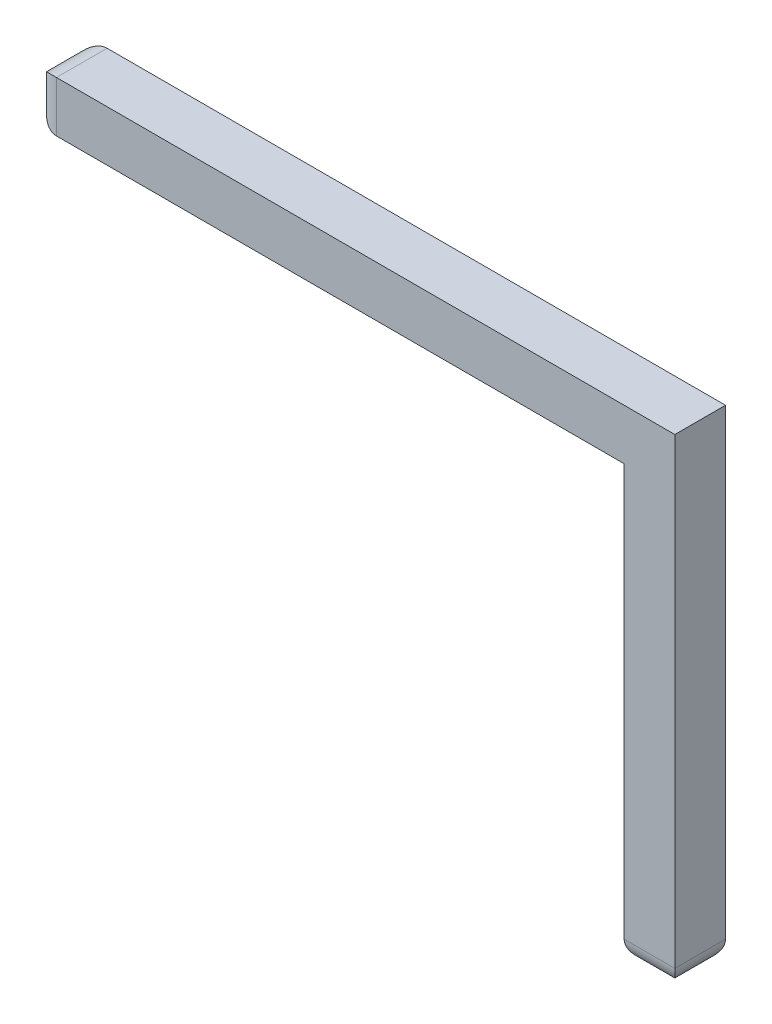
ISO-10303-21;
HEADER;
FILE_DESCRIPTION(('STEP AP214'),'2;1');
FILE_NAME('part.step','',(''),(''),'','','');
FILE_SCHEMA(('AUTOMOTIVE_DESIGN { 1 0 10303 214 1 1 1 1 }'));
ENDSEC;
DATA;
#1=APPLICATION_CONTEXT('core data for automotive mechanical design processes');
#2=APPLICATION_PROTOCOL_DEFINITION('international standard','automotive_design',2000,#1);
#3=PRODUCT_CONTEXT('',#1,'mechanical');
#4=PRODUCT('Part','Part','',(#3));
#5=PRODUCT_RELATED_PRODUCT_CATEGORY('part','',(#4));
#6=PRODUCT_DEFINITION_FORMATION('','',#4);
#7=PRODUCT_DEFINITION_CONTEXT('part definition',#1,'design');
#8=PRODUCT_DEFINITION('design','',#6,#7);
#9=PRODUCT_DEFINITION_SHAPE('','',#8);
#10=(LENGTH_UNIT() NAMED_UNIT(*) SI_UNIT(.MILLI.,.METRE.));
#11=(NAMED_UNIT(*) PLANE_ANGLE_UNIT() SI_UNIT($,.RADIAN.));
#12=(NAMED_UNIT(*) SI_UNIT($,.STERADIAN.) SOLID_ANGLE_UNIT());
#13=UNCERTAINTY_MEASURE_WITH_UNIT(LENGTH_MEASURE(1.E-05),#10,'distance_accuracy_value','');
#14=(GEOMETRIC_REPRESENTATION_CONTEXT(3) GLOBAL_UNCERTAINTY_ASSIGNED_CONTEXT((#13)) GLOBAL_UNIT_ASSIGNED_CONTEXT((#10,
#11,#12)) REPRESENTATION_CONTEXT('',''));
#15=CARTESIAN_POINT('',(0.,0.,0.));
#16=DIRECTION('',(0.,0.,1.));
#17=DIRECTION('',(1.,0.,0.));
#18=AXIS2_PLACEMENT_3D('',#15,#16,#17);
#19=CARTESIAN_POINT('',(2.7075,-0.55,11.095));
#20=DIRECTION('',(1.,0.,0.));
#21=DIRECTION('',(0.,-0.707106781186548,-0.707106781186548));
#22=AXIS2_PLACEMENT_3D('',#19,#20,#21);
#23=CYLINDRICAL_SURFACE('',#22,0.25);
#24=DIRECTION('',(-1.,0.,0.));
#25=VECTOR('',#24,1.);
#26=CARTESIAN_POINT('',(2.7075,-0.8,11.095));
#27=LINE('',#26,#25);
#28=CARTESIAN_POINT('',(2.615,-0.8,11.095));
#29=VERTEX_POINT('',#28);
#30=CARTESIAN_POINT('',(2.485,-0.8,11.095));
#31=VERTEX_POINT('',#30);
#32=EDGE_CURVE('E11',#29,#31,#27,.T.);
#33=ORIENTED_EDGE('',*,*,#32,.T.);
#34=CARTESIAN_POINT('',(2.485,-0.55,11.095));
#35=DIRECTION('',(0.707106781186548,0.,-0.707106781186548));
#36=DIRECTION('',(-0.707106781186548,0.,-0.707106781186548));
#37=AXIS2_PLACEMENT_3D('',#34,#35,#36);
#38=ELLIPSE('',#37,0.353553390593,0.25);
#39=CARTESIAN_POINT('',(2.235,-0.55,10.845));
#40=VERTEX_POINT('',#39);
#41=EDGE_CURVE('E27',#31,#40,#38,.T.);
#42=ORIENTED_EDGE('',*,*,#41,.T.);
#43=DIRECTION('',(1.,0.,0.));
#44=VECTOR('',#43,1.);
#45=CARTESIAN_POINT('',(2.7075,-0.55,10.845));
#46=LINE('',#45,#44);
#47=CARTESIAN_POINT('',(2.865,-0.55,10.845));
#48=VERTEX_POINT('',#47);
#49=EDGE_CURVE('E180',#40,#48,#46,.T.);
#50=ORIENTED_EDGE('',*,*,#49,.T.);
#51=CARTESIAN_POINT('',(2.615,-0.55,11.095));
#52=DIRECTION('',(0.707106781186548,0.,0.707106781186548));
#53=DIRECTION('',(0.707106781186548,0.,-0.707106781186548));
#54=AXIS2_PLACEMENT_3D('',#51,#52,#53);
#55=ELLIPSE('',#54,0.353553390593,0.25);
#56=EDGE_CURVE('E161',#29,#48,#55,.T.);
#57=ORIENTED_EDGE('',*,*,#56,.F.);
#58=EDGE_LOOP('',(#33,#42,#50,#57));
#59=FACE_BOUND('',#58,.T.);
#60=ADVANCED_FACE('F17',(#59),#23,.T.);
#61=CARTESIAN_POINT('',(2.485,-0.55,11.0025));
#62=DIRECTION('',(0.,0.,-1.));
#63=DIRECTION('',(-0.707106781186548,-0.707106781186548,0.));
#64=AXIS2_PLACEMENT_3D('',#61,#62,#63);
#65=CYLINDRICAL_SURFACE('',#64,0.25);
#66=DIRECTION('',(0.,0.,1.));
#67=VECTOR('',#66,1.);
#68=CARTESIAN_POINT('',(2.485,-0.8,11.0025));
#69=LINE('',#68,#67);
#70=CARTESIAN_POINT('',(2.485,-0.8,11.225));
#71=VERTEX_POINT('',#70);
#72=EDGE_CURVE('E178',#31,#71,#69,.T.);
#73=ORIENTED_EDGE('',*,*,#72,.T.);
#74=CARTESIAN_POINT('',(2.485,-0.55,11.225));
#75=DIRECTION('',(-0.707106781186548,0.,-0.707106781186548));
#76=DIRECTION('',(-0.707106781186548,0.,0.707106781186548));
#77=AXIS2_PLACEMENT_3D('',#74,#75,#76);
#78=ELLIPSE('',#77,0.353553390593,0.25);
#79=CARTESIAN_POINT('',(2.235,-0.55,11.475));
#80=VERTEX_POINT('',#79);
#81=EDGE_CURVE('E176',#71,#80,#78,.T.);
#82=ORIENTED_EDGE('',*,*,#81,.T.);
#83=DIRECTION('',(0.,0.,-1.));
#84=VECTOR('',#83,1.);
#85=CARTESIAN_POINT('',(2.235,-0.55,11.0025));
#86=LINE('',#85,#84);
#87=EDGE_CURVE('E118',#80,#40,#86,.T.);
#88=ORIENTED_EDGE('',*,*,#87,.T.);
#89=ORIENTED_EDGE('',*,*,#41,.F.);
#90=EDGE_LOOP('',(#73,#82,#88,#89));
#91=FACE_BOUND('',#90,.T.);
#92=ADVANCED_FACE('F207',(#91),#65,.T.);
#93=CARTESIAN_POINT('',(2.3925,-0.55,11.225));
#94=DIRECTION('',(-1.,0.,0.));
#95=DIRECTION('',(0.,-0.707106781186548,0.707106781186548));
#96=AXIS2_PLACEMENT_3D('',#93,#94,#95);
#97=CYLINDRICAL_SURFACE('',#96,0.25);
#98=DIRECTION('',(1.,0.,0.));
#99=VECTOR('',#98,1.);
#100=CARTESIAN_POINT('',(2.3925,-0.8,11.225));
#101=LINE('',#100,#99);
#102=CARTESIAN_POINT('',(2.615,-0.8,11.225));
#103=VERTEX_POINT('',#102);
#104=EDGE_CURVE('E172',#71,#103,#101,.T.);
#105=ORIENTED_EDGE('',*,*,#104,.T.);
#106=CARTESIAN_POINT('',(2.615,-0.55,11.225));
#107=DIRECTION('',(-0.707106781186548,0.,0.707106781186548));
#108=DIRECTION('',(0.707106781186548,0.,0.707106781186548));
#109=AXIS2_PLACEMENT_3D('',#106,#107,#108);
#110=ELLIPSE('',#109,0.353553390593,0.25);
#111=CARTESIAN_POINT('',(2.865,-0.55,11.475));
#112=VERTEX_POINT('',#111);
#113=EDGE_CURVE('E169',#103,#112,#110,.T.);
#114=ORIENTED_EDGE('',*,*,#113,.T.);
#115=DIRECTION('',(-1.,0.,0.));
#116=VECTOR('',#115,1.);
#117=CARTESIAN_POINT('',(2.3925,-0.55,11.475));
#118=LINE('',#117,#116);
#119=EDGE_CURVE('E167',#112,#80,#118,.T.);
#120=ORIENTED_EDGE('',*,*,#119,.T.);
#121=ORIENTED_EDGE('',*,*,#81,.F.);
#122=EDGE_LOOP('',(#105,#114,#120,#121));
#123=FACE_BOUND('',#122,.T.);
#124=ADVANCED_FACE('F202',(#123),#97,.T.);
#125=CARTESIAN_POINT('',(2.615,-0.55,11.3175));
#126=DIRECTION('',(0.,0.,1.));
#127=DIRECTION('',(0.707106781186548,-0.707106781186548,0.));
#128=AXIS2_PLACEMENT_3D('',#125,#126,#127);
#129=CYLINDRICAL_SURFACE('',#128,0.25);
#130=DIRECTION('',(0.,0.,1.));
#131=VECTOR('',#130,1.);
#132=CARTESIAN_POINT('',(2.865,-0.55,11.3175));
#133=LINE('',#132,#131);
#134=EDGE_CURVE('E165',#48,#112,#133,.T.);
#135=ORIENTED_EDGE('',*,*,#134,.T.);
#136=ORIENTED_EDGE('',*,*,#113,.F.);
#137=DIRECTION('',(0.,0.,-1.));
#138=VECTOR('',#137,1.);
#139=CARTESIAN_POINT('',(2.615,-0.8,11.3175));
#140=LINE('',#139,#138);
#141=EDGE_CURVE('E162',#103,#29,#140,.T.);
#142=ORIENTED_EDGE('',*,*,#141,.T.);
#143=ORIENTED_EDGE('',*,*,#56,.T.);
#144=EDGE_LOOP('',(#135,#136,#142,#143));
#145=FACE_BOUND('',#144,.T.);
#146=ADVANCED_FACE('F200',(#145),#129,.T.);
#147=CARTESIAN_POINT('',(2.865,3.2,11.475));
#148=DIRECTION('',(1.,0.,0.));
#149=DIRECTION('',(0.,0.,-1.));
#150=AXIS2_PLACEMENT_3D('',#147,#148,#149);
#151=PLANE('',#150);
#152=ORIENTED_EDGE('',*,*,#134,.F.);
#153=DIRECTION('',(0.,1.,0.));
#154=VECTOR('',#153,1.);
#155=CARTESIAN_POINT('',(2.865,3.2,10.845));
#156=LINE('',#155,#154);
#157=CARTESIAN_POINT('',(2.865,5.2,10.845));
#158=VERTEX_POINT('',#157);
#159=EDGE_CURVE('E156',#48,#158,#156,.T.);
#160=ORIENTED_EDGE('',*,*,#159,.T.);
#161=DIRECTION('',(0.,0.,-1.));
#162=VECTOR('',#161,1.);
#163=CARTESIAN_POINT('',(2.865,5.2,10.845));
#164=LINE('',#163,#162);
#165=CARTESIAN_POINT('',(2.865,5.2,11.475));
#166=VERTEX_POINT('',#165);
#167=EDGE_CURVE('E143',#166,#158,#164,.T.);
#168=ORIENTED_EDGE('',*,*,#167,.F.);
#169=DIRECTION('',(0.,1.,0.));
#170=VECTOR('',#169,1.);
#171=CARTESIAN_POINT('',(2.865,3.2,11.475));
#172=LINE('',#171,#170);
#173=EDGE_CURVE('E106',#112,#166,#172,.T.);
#174=ORIENTED_EDGE('',*,*,#173,.F.);
#175=EDGE_LOOP('',(#152,#160,#168,#174));
#176=FACE_BOUND('',#175,.T.);
#177=ADVANCED_FACE('F197',(#176),#151,.T.);
#178=CARTESIAN_POINT('',(2.865,3.2,10.845));
#179=DIRECTION('',(0.,0.,-1.));
#180=DIRECTION('',(-1.,0.,0.));
#181=AXIS2_PLACEMENT_3D('',#178,#179,#180);
#182=PLANE('',#181);
#183=ORIENTED_EDGE('',*,*,#49,.F.);
#184=DIRECTION('',(0.,1.,0.));
#185=VECTOR('',#184,1.);
#186=CARTESIAN_POINT('',(2.235,3.2,10.845));
#187=LINE('',#186,#185);
#188=CARTESIAN_POINT('',(2.235,4.57,10.845));
#189=VERTEX_POINT('',#188);
#190=EDGE_CURVE('E155',#40,#189,#187,.T.);
#191=ORIENTED_EDGE('',*,*,#190,.T.);
#192=DIRECTION('',(-1.,0.,0.));
#193=VECTOR('',#192,1.);
#194=CARTESIAN_POINT('',(2.235,4.57,10.845));
#195=LINE('',#194,#193);
#196=CARTESIAN_POINT('',(-4.825,4.57,10.845));
#197=VERTEX_POINT('',#196);
#198=EDGE_CURVE('E101',#189,#197,#195,.T.);
#199=ORIENTED_EDGE('',*,*,#198,.T.);
#200=DIRECTION('',(0.,-1.,0.));
#201=VECTOR('',#200,1.);
#202=CARTESIAN_POINT('',(-4.825,4.0425,10.845));
#203=LINE('',#202,#201);
#204=CARTESIAN_POINT('',(-4.825,5.2,10.845));
#205=VERTEX_POINT('',#204);
#206=EDGE_CURVE('E127',#205,#197,#203,.T.);
#207=ORIENTED_EDGE('',*,*,#206,.F.);
#208=DIRECTION('',(-1.,0.,0.));
#209=VECTOR('',#208,1.);
#210=CARTESIAN_POINT('',(2.235,5.2,10.845));
#211=LINE('',#210,#209);
#212=EDGE_CURVE('E115',#158,#205,#211,.T.);
#213=ORIENTED_EDGE('',*,*,#212,.F.);
#214=ORIENTED_EDGE('',*,*,#159,.F.);
#215=EDGE_LOOP('',(#183,#191,#199,#207,#213,#214));
#216=FACE_BOUND('',#215,.T.);
#217=ADVANCED_FACE('F191',(#216),#182,.T.);
#218=CARTESIAN_POINT('',(2.55,-0.8,11.16));
#219=DIRECTION('',(0.,-1.,0.));
#220=DIRECTION('',(0.,0.,-1.));
#221=AXIS2_PLACEMENT_3D('',#218,#219,#220);
#222=PLANE('',#221);
#223=ORIENTED_EDGE('',*,*,#32,.F.);
#224=ORIENTED_EDGE('',*,*,#141,.F.);
#225=ORIENTED_EDGE('',*,*,#104,.F.);
#226=ORIENTED_EDGE('',*,*,#72,.F.);
#227=EDGE_LOOP('',(#223,#224,#225,#226));
#228=FACE_BOUND('',#227,.T.);
#229=ADVANCED_FACE('F206',(#228),#222,.T.);
#230=CARTESIAN_POINT('',(-4.825,4.9,11.16));
#231=DIRECTION('',(0.,0.,-1.));
#232=DIRECTION('',(-0.707106781186548,0.707106781186548,0.));
#233=AXIS2_PLACEMENT_3D('',#230,#231,#232);
#234=CYLINDRICAL_SURFACE('',#233,0.3);
#235=DIRECTION('',(0.,0.,1.));
#236=VECTOR('',#235,1.);
#237=CARTESIAN_POINT('',(-5.125,4.9,11.16));
#238=LINE('',#237,#236);
#239=CARTESIAN_POINT('',(-5.125,4.9,11.145));
#240=VERTEX_POINT('',#239);
#241=CARTESIAN_POINT('',(-5.125,4.9,11.175));
#242=VERTEX_POINT('',#241);
#243=EDGE_CURVE('E149',#240,#242,#238,.T.);
#244=ORIENTED_EDGE('',*,*,#243,.T.);
#245=CARTESIAN_POINT('',(-4.825,4.9,11.175));
#246=DIRECTION('',(0.,0.707106781186548,-0.707106781186548));
#247=DIRECTION('',(0.,0.707106781186548,0.707106781186548));
#248=AXIS2_PLACEMENT_3D('',#245,#246,#247);
#249=ELLIPSE('',#248,0.424264068712,0.3);
#250=CARTESIAN_POINT('',(-4.825,5.2,11.475));
#251=VERTEX_POINT('',#250);
#252=EDGE_CURVE('E146',#242,#251,#249,.T.);
#253=ORIENTED_EDGE('',*,*,#252,.T.);
#254=DIRECTION('',(0.,0.,-1.));
#255=VECTOR('',#254,1.);
#256=CARTESIAN_POINT('',(-4.825,5.2,11.16));
#257=LINE('',#256,#255);
#258=EDGE_CURVE('E140',#251,#205,#257,.T.);
#259=ORIENTED_EDGE('',*,*,#258,.T.);
#260=CARTESIAN_POINT('',(-4.825,4.9,11.145));
#261=DIRECTION('',(0.,-0.707106781186548,-0.707106781186548));
#262=DIRECTION('',(0.,0.707106781186548,-0.707106781186548));
#263=AXIS2_PLACEMENT_3D('',#260,#261,#262);
#264=ELLIPSE('',#263,0.424264068712,0.3);
#265=EDGE_CURVE('E128',#240,#205,#264,.T.);
#266=ORIENTED_EDGE('',*,*,#265,.F.);
#267=EDGE_LOOP('',(#244,#253,#259,#266));
#268=FACE_BOUND('',#267,.T.);
#269=ADVANCED_FACE('F226',(#268),#234,.T.);
#270=CARTESIAN_POINT('',(-4.825,4.0425,11.175));
#271=DIRECTION('',(0.,1.,0.));
#272=DIRECTION('',(-0.707106781186548,0.,0.707106781186548));
#273=AXIS2_PLACEMENT_3D('',#270,#271,#272);
#274=CYLINDRICAL_SURFACE('',#273,0.3);
#275=DIRECTION('',(0.,-1.,0.));
#276=VECTOR('',#275,1.);
#277=CARTESIAN_POINT('',(-5.125,4.0425,11.175));
#278=LINE('',#277,#276);
#279=CARTESIAN_POINT('',(-5.125,4.87,11.175));
#280=VERTEX_POINT('',#279);
#281=EDGE_CURVE('E137',#242,#280,#278,.T.);
#282=ORIENTED_EDGE('',*,*,#281,.T.);
#283=CARTESIAN_POINT('',(-4.825,4.87,11.175));
#284=DIRECTION('',(0.,0.707106781186548,0.707106781186548));
#285=DIRECTION('',(0.,-0.707106781186548,0.707106781186548));
#286=AXIS2_PLACEMENT_3D('',#283,#284,#285);
#287=ELLIPSE('',#286,0.424264068712,0.3);
#288=CARTESIAN_POINT('',(-4.825,4.57,11.475));
#289=VERTEX_POINT('',#288);
#290=EDGE_CURVE('E135',#280,#289,#287,.T.);
#291=ORIENTED_EDGE('',*,*,#290,.T.);
#292=DIRECTION('',(0.,1.,0.));
#293=VECTOR('',#292,1.);
#294=CARTESIAN_POINT('',(-4.825,4.0425,11.475));
#295=LINE('',#294,#293);
#296=EDGE_CURVE('E113',#289,#251,#295,.T.);
#297=ORIENTED_EDGE('',*,*,#296,.T.);
#298=ORIENTED_EDGE('',*,*,#252,.F.);
#299=EDGE_LOOP('',(#282,#291,#297,#298));
#300=FACE_BOUND('',#299,.T.);
#301=ADVANCED_FACE('F229',(#300),#274,.T.);
#302=CARTESIAN_POINT('',(-4.825,4.87,11.0025));
#303=DIRECTION('',(0.,0.,1.));
#304=DIRECTION('',(-0.707106781186548,-0.707106781186548,0.));
#305=AXIS2_PLACEMENT_3D('',#302,#303,#304);
#306=CYLINDRICAL_SURFACE('',#305,0.3);
#307=DIRECTION('',(0.,0.,-1.));
#308=VECTOR('',#307,1.);
#309=CARTESIAN_POINT('',(-5.125,4.87,11.0025));
#310=LINE('',#309,#308);
#311=CARTESIAN_POINT('',(-5.125,4.87,11.145));
#312=VERTEX_POINT('',#311);
#313=EDGE_CURVE('E132',#280,#312,#310,.T.);
#314=ORIENTED_EDGE('',*,*,#313,.T.);
#315=CARTESIAN_POINT('',(-4.825,4.87,11.145));
#316=DIRECTION('',(0.,-0.707106781186548,0.707106781186548));
#317=DIRECTION('',(0.,-0.707106781186548,-0.707106781186548));
#318=AXIS2_PLACEMENT_3D('',#315,#316,#317);
#319=ELLIPSE('',#318,0.424264068712,0.3);
#320=EDGE_CURVE('E89',#312,#197,#319,.T.);
#321=ORIENTED_EDGE('',*,*,#320,.T.);
#322=DIRECTION('',(0.,0.,1.));
#323=VECTOR('',#322,1.);
#324=CARTESIAN_POINT('',(-4.825,4.57,11.0025));
#325=LINE('',#324,#323);
#326=EDGE_CURVE('E129',#197,#289,#325,.T.);
#327=ORIENTED_EDGE('',*,*,#326,.T.);
#328=ORIENTED_EDGE('',*,*,#290,.F.);
#329=EDGE_LOOP('',(#314,#321,#327,#328));
#330=FACE_BOUND('',#329,.T.);
#331=ADVANCED_FACE('F233',(#330),#306,.T.);
#332=CARTESIAN_POINT('',(-4.825,4.0425,11.145));
#333=DIRECTION('',(0.,-1.,0.));
#334=DIRECTION('',(-0.707106781186548,0.,-0.707106781186548));
#335=AXIS2_PLACEMENT_3D('',#332,#333,#334);
#336=CYLINDRICAL_SURFACE('',#335,0.3);
#337=ORIENTED_EDGE('',*,*,#206,.T.);
#338=ORIENTED_EDGE('',*,*,#320,.F.);
#339=DIRECTION('',(0.,1.,0.));
#340=VECTOR('',#339,1.);
#341=CARTESIAN_POINT('',(-5.125,4.0425,11.145));
#342=LINE('',#341,#340);
#343=EDGE_CURVE('E125',#312,#240,#342,.T.);
#344=ORIENTED_EDGE('',*,*,#343,.T.);
#345=ORIENTED_EDGE('',*,*,#265,.T.);
#346=EDGE_LOOP('',(#337,#338,#344,#345));
#347=FACE_BOUND('',#346,.T.);
#348=ADVANCED_FACE('F237',(#347),#336,.T.);
#349=CARTESIAN_POINT('',(2.55,5.2,11.16));
#350=DIRECTION('',(0.,1.,0.));
#351=DIRECTION('',(0.,0.,1.));
#352=AXIS2_PLACEMENT_3D('',#349,#350,#351);
#353=PLANE('',#352);
#354=ORIENTED_EDGE('',*,*,#258,.F.);
#355=DIRECTION('',(-1.,0.,0.));
#356=VECTOR('',#355,1.);
#357=CARTESIAN_POINT('',(2.235,5.2,11.475));
#358=LINE('',#357,#356);
#359=EDGE_CURVE('E120',#166,#251,#358,.T.);
#360=ORIENTED_EDGE('',*,*,#359,.F.);
#361=ORIENTED_EDGE('',*,*,#167,.T.);
#362=ORIENTED_EDGE('',*,*,#212,.T.);
#363=EDGE_LOOP('',(#354,#360,#361,#362));
#364=FACE_BOUND('',#363,.T.);
#365=ADVANCED_FACE('F241',(#364),#353,.T.);
#366=CARTESIAN_POINT('',(-5.125,4.885,11.16));
#367=DIRECTION('',(-1.,0.,0.));
#368=DIRECTION('',(0.,0.,1.));
#369=AXIS2_PLACEMENT_3D('',#366,#367,#368);
#370=PLANE('',#369);
#371=ORIENTED_EDGE('',*,*,#243,.F.);
#372=ORIENTED_EDGE('',*,*,#343,.F.);
#373=ORIENTED_EDGE('',*,*,#313,.F.);
#374=ORIENTED_EDGE('',*,*,#281,.F.);
#375=EDGE_LOOP('',(#371,#372,#373,#374));
#376=FACE_BOUND('',#375,.T.);
#377=ADVANCED_FACE('F244',(#376),#370,.T.);
#378=CARTESIAN_POINT('',(2.235,4.57,10.845));
#379=DIRECTION('',(0.,-1.,0.));
#380=DIRECTION('',(0.,0.,1.));
#381=AXIS2_PLACEMENT_3D('',#378,#379,#380);
#382=PLANE('',#381);
#383=ORIENTED_EDGE('',*,*,#326,.F.);
#384=ORIENTED_EDGE('',*,*,#198,.F.);
#385=DIRECTION('',(0.,0.,-1.));
#386=VECTOR('',#385,1.);
#387=CARTESIAN_POINT('',(2.235,4.57,10.845));
#388=LINE('',#387,#386);
#389=CARTESIAN_POINT('',(2.235,4.57,11.475));
#390=VERTEX_POINT('',#389);
#391=EDGE_CURVE('E95',#390,#189,#388,.T.);
#392=ORIENTED_EDGE('',*,*,#391,.F.);
#393=DIRECTION('',(-1.,0.,0.));
#394=VECTOR('',#393,1.);
#395=CARTESIAN_POINT('',(2.235,4.57,11.475));
#396=LINE('',#395,#394);
#397=EDGE_CURVE('E99',#390,#289,#396,.T.);
#398=ORIENTED_EDGE('',*,*,#397,.T.);
#399=EDGE_LOOP('',(#383,#384,#392,#398));
#400=FACE_BOUND('',#399,.T.);
#401=ADVANCED_FACE('F98',(#400),#382,.T.);
#402=CARTESIAN_POINT('',(2.235,3.2,10.845));
#403=DIRECTION('',(-1.,0.,0.));
#404=DIRECTION('',(0.,0.,1.));
#405=AXIS2_PLACEMENT_3D('',#402,#403,#404);
#406=PLANE('',#405);
#407=ORIENTED_EDGE('',*,*,#87,.F.);
#408=DIRECTION('',(0.,-1.,0.));
#409=VECTOR('',#408,1.);
#410=CARTESIAN_POINT('',(2.235,3.2,11.475));
#411=LINE('',#410,#409);
#412=EDGE_CURVE('E21',#390,#80,#411,.T.);
#413=ORIENTED_EDGE('',*,*,#412,.F.);
#414=ORIENTED_EDGE('',*,*,#391,.T.);
#415=ORIENTED_EDGE('',*,*,#190,.F.);
#416=EDGE_LOOP('',(#407,#413,#414,#415));
#417=FACE_BOUND('',#416,.T.);
#418=ADVANCED_FACE('F117',(#417),#406,.T.);
#419=CARTESIAN_POINT('',(2.235,3.2,11.475));
#420=DIRECTION('',(0.,0.,1.));
#421=DIRECTION('',(1.,0.,0.));
#422=AXIS2_PLACEMENT_3D('',#419,#420,#421);
#423=PLANE('',#422);
#424=ORIENTED_EDGE('',*,*,#119,.F.);
#425=ORIENTED_EDGE('',*,*,#173,.T.);
#426=ORIENTED_EDGE('',*,*,#359,.T.);
#427=ORIENTED_EDGE('',*,*,#296,.F.);
#428=ORIENTED_EDGE('',*,*,#397,.F.);
#429=ORIENTED_EDGE('',*,*,#412,.T.);
#430=EDGE_LOOP('',(#424,#425,#426,#427,#428,#429));
#431=FACE_BOUND('',#430,.T.);
#432=ADVANCED_FACE('F19',(#431),#423,.T.);
#433=CLOSED_SHELL('',(#60,#92,#124,#146,#177,#217,#229,#269,#301,#331,#348,#365,#377,#401,#418,#432));
#434=MANIFOLD_SOLID_BREP('B1',#433);
#435=ADVANCED_BREP_SHAPE_REPRESENTATION('',(#18,#434),#14);
#436=SHAPE_DEFINITION_REPRESENTATION(#9,#435);
ENDSEC;
END-ISO-10303-21;
